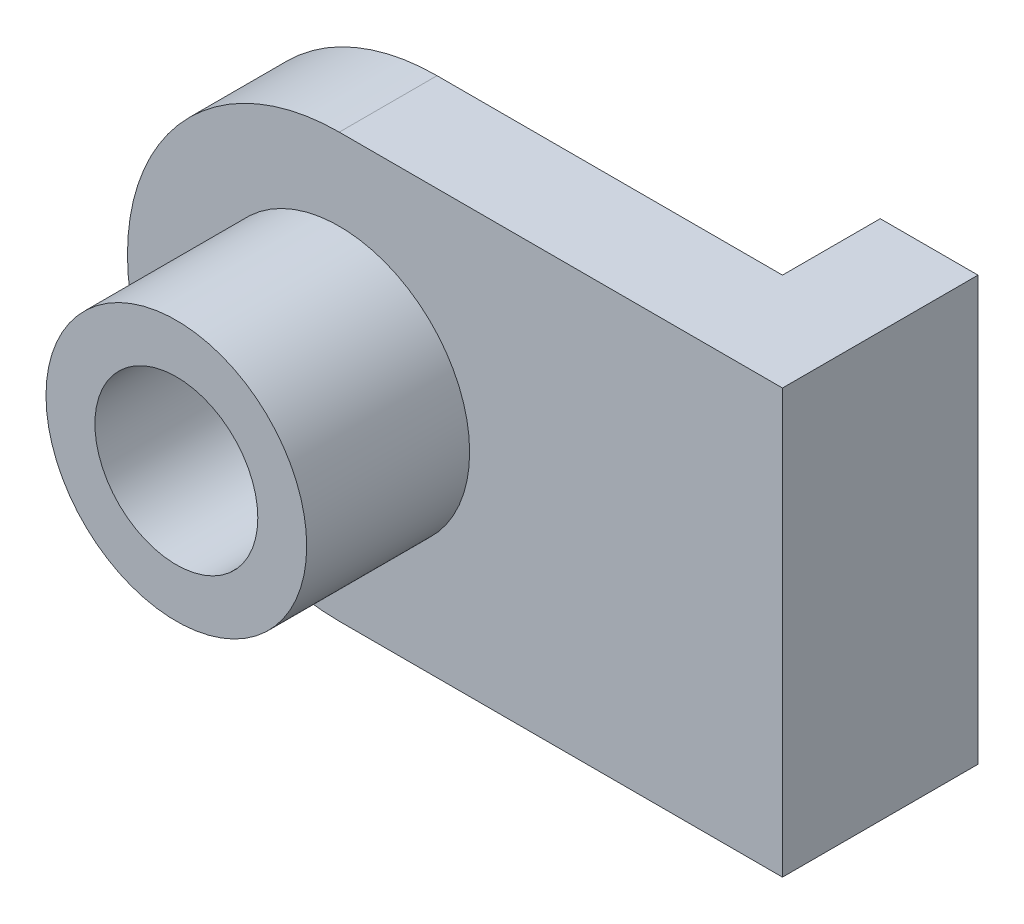
ISO-10303-21;
HEADER;
FILE_DESCRIPTION(('STEP AP214'),'2;1');
FILE_NAME('part.step','',(''),(''),'','','');
FILE_SCHEMA(('AUTOMOTIVE_DESIGN { 1 0 10303 214 1 1 1 1 }'));
ENDSEC;
DATA;
#1=APPLICATION_CONTEXT('core data for automotive mechanical design processes');
#2=APPLICATION_PROTOCOL_DEFINITION('international standard','automotive_design',2000,#1);
#3=PRODUCT_CONTEXT('',#1,'mechanical');
#4=PRODUCT('Part','Part','',(#3));
#5=PRODUCT_RELATED_PRODUCT_CATEGORY('part','',(#4));
#6=PRODUCT_DEFINITION_FORMATION('','',#4);
#7=PRODUCT_DEFINITION_CONTEXT('part definition',#1,'design');
#8=PRODUCT_DEFINITION('design','',#6,#7);
#9=PRODUCT_DEFINITION_SHAPE('','',#8);
#10=(LENGTH_UNIT() NAMED_UNIT(*) SI_UNIT(.MILLI.,.METRE.));
#11=(NAMED_UNIT(*) PLANE_ANGLE_UNIT() SI_UNIT($,.RADIAN.));
#12=(NAMED_UNIT(*) SI_UNIT($,.STERADIAN.) SOLID_ANGLE_UNIT());
#13=UNCERTAINTY_MEASURE_WITH_UNIT(LENGTH_MEASURE(1.E-05),#10,'distance_accuracy_value','');
#14=(GEOMETRIC_REPRESENTATION_CONTEXT(3) GLOBAL_UNCERTAINTY_ASSIGNED_CONTEXT((#13)) GLOBAL_UNIT_ASSIGNED_CONTEXT((#10,
#11,#12)) REPRESENTATION_CONTEXT('',''));
#15=CARTESIAN_POINT('',(0.,0.,0.));
#16=DIRECTION('',(0.,0.,1.));
#17=DIRECTION('',(1.,0.,0.));
#18=AXIS2_PLACEMENT_3D('',#15,#16,#17);
#19=CARTESIAN_POINT('',(0.,32.5,15.));
#20=DIRECTION('',(0.,0.,-1.));
#21=DIRECTION('',(-1.,0.,0.));
#22=AXIS2_PLACEMENT_3D('',#19,#20,#21);
#23=CYLINDRICAL_SURFACE('',#22,32.5);
#24=CARTESIAN_POINT('',(0.,32.5,0.));
#25=DIRECTION('',(0.,0.,1.));
#26=DIRECTION('',(1.,0.,0.));
#27=AXIS2_PLACEMENT_3D('',#24,#25,#26);
#28=CIRCLE('',#27,32.5);
#29=CARTESIAN_POINT('',(0.,65.,0.));
#30=VERTEX_POINT('',#29);
#31=CARTESIAN_POINT('',(0.,0.,0.));
#32=VERTEX_POINT('',#31);
#33=EDGE_CURVE('E131',#30,#32,#28,.T.);
#34=ORIENTED_EDGE('',*,*,#33,.T.);
#35=DIRECTION('',(0.,0.,-1.));
#36=VECTOR('',#35,1.);
#37=CARTESIAN_POINT('',(0.,0.,15.));
#38=LINE('',#37,#36);
#39=CARTESIAN_POINT('',(0.,0.,15.));
#40=VERTEX_POINT('',#39);
#41=EDGE_CURVE('E39',#40,#32,#38,.T.);
#42=ORIENTED_EDGE('',*,*,#41,.F.);
#43=CARTESIAN_POINT('',(0.,32.5,15.));
#44=DIRECTION('',(0.,0.,1.));
#45=DIRECTION('',(1.,0.,0.));
#46=AXIS2_PLACEMENT_3D('',#43,#44,#45);
#47=CIRCLE('',#46,32.5);
#48=CARTESIAN_POINT('',(0.,65.,15.));
#49=VERTEX_POINT('',#48);
#50=EDGE_CURVE('E133',#49,#40,#47,.T.);
#51=ORIENTED_EDGE('',*,*,#50,.F.);
#52=DIRECTION('',(0.,0.,-1.));
#53=VECTOR('',#52,1.);
#54=CARTESIAN_POINT('',(0.,65.,15.));
#55=LINE('',#54,#53);
#56=EDGE_CURVE('E139',#49,#30,#55,.T.);
#57=ORIENTED_EDGE('',*,*,#56,.T.);
#58=EDGE_LOOP('',(#34,#42,#51,#57));
#59=FACE_BOUND('',#58,.T.);
#60=ADVANCED_FACE('F36',(#59),#23,.T.);
#61=CARTESIAN_POINT('',(0.,0.,15.));
#62=DIRECTION('',(0.,1.,0.));
#63=DIRECTION('',(0.,0.,1.));
#64=AXIS2_PLACEMENT_3D('',#61,#62,#63);
#65=PLANE('',#64);
#66=DIRECTION('',(1.,0.,0.));
#67=VECTOR('',#66,1.);
#68=CARTESIAN_POINT('',(0.,0.,0.));
#69=LINE('',#68,#67);
#70=CARTESIAN_POINT('',(53.,0.,0.));
#71=VERTEX_POINT('',#70);
#72=EDGE_CURVE('E101',#32,#71,#69,.T.);
#73=ORIENTED_EDGE('',*,*,#72,.T.);
#74=DIRECTION('',(0.,0.,1.));
#75=VECTOR('',#74,1.);
#76=CARTESIAN_POINT('',(53.,0.,-15.));
#77=LINE('',#76,#75);
#78=CARTESIAN_POINT('',(53.,0.,-15.));
#79=VERTEX_POINT('',#78);
#80=EDGE_CURVE('E51',#79,#71,#77,.T.);
#81=ORIENTED_EDGE('',*,*,#80,.F.);
#82=DIRECTION('',(1.,0.,0.));
#83=VECTOR('',#82,1.);
#84=CARTESIAN_POINT('',(53.,0.,-15.));
#85=LINE('',#84,#83);
#86=CARTESIAN_POINT('',(68.,0.,-15.));
#87=VERTEX_POINT('',#86);
#88=EDGE_CURVE('E100',#79,#87,#85,.T.);
#89=ORIENTED_EDGE('',*,*,#88,.T.);
#90=DIRECTION('',(0.,0.,-1.));
#91=VECTOR('',#90,1.);
#92=CARTESIAN_POINT('',(68.,0.,15.));
#93=LINE('',#92,#91);
#94=CARTESIAN_POINT('',(68.,0.,15.));
#95=VERTEX_POINT('',#94);
#96=EDGE_CURVE('E146',#95,#87,#93,.T.);
#97=ORIENTED_EDGE('',*,*,#96,.F.);
#98=DIRECTION('',(1.,0.,0.));
#99=VECTOR('',#98,1.);
#100=CARTESIAN_POINT('',(0.,0.,15.));
#101=LINE('',#100,#99);
#102=EDGE_CURVE('E83',#40,#95,#101,.T.);
#103=ORIENTED_EDGE('',*,*,#102,.F.);
#104=ORIENTED_EDGE('',*,*,#41,.T.);
#105=EDGE_LOOP('',(#73,#81,#89,#97,#103,#104));
#106=FACE_BOUND('',#105,.T.);
#107=ADVANCED_FACE('F99',(#106),#65,.F.);
#108=CARTESIAN_POINT('',(68.,0.,15.));
#109=DIRECTION('',(-1.,0.,0.));
#110=DIRECTION('',(0.,0.,1.));
#111=AXIS2_PLACEMENT_3D('',#108,#109,#110);
#112=PLANE('',#111);
#113=ORIENTED_EDGE('',*,*,#96,.T.);
#114=DIRECTION('',(0.,1.,0.));
#115=VECTOR('',#114,1.);
#116=CARTESIAN_POINT('',(68.,0.,-15.));
#117=LINE('',#116,#115);
#118=CARTESIAN_POINT('',(68.,65.,-15.));
#119=VERTEX_POINT('',#118);
#120=EDGE_CURVE('E113',#87,#119,#117,.T.);
#121=ORIENTED_EDGE('',*,*,#120,.T.);
#122=DIRECTION('',(0.,0.,-1.));
#123=VECTOR('',#122,1.);
#124=CARTESIAN_POINT('',(68.,65.,15.));
#125=LINE('',#124,#123);
#126=CARTESIAN_POINT('',(68.,65.,15.));
#127=VERTEX_POINT('',#126);
#128=EDGE_CURVE('E145',#127,#119,#125,.T.);
#129=ORIENTED_EDGE('',*,*,#128,.F.);
#130=DIRECTION('',(0.,1.,0.));
#131=VECTOR('',#130,1.);
#132=CARTESIAN_POINT('',(68.,0.,15.));
#133=LINE('',#132,#131);
#134=EDGE_CURVE('E136',#95,#127,#133,.T.);
#135=ORIENTED_EDGE('',*,*,#134,.F.);
#136=EDGE_LOOP('',(#113,#121,#129,#135));
#137=FACE_BOUND('',#136,.T.);
#138=ADVANCED_FACE('F175',(#137),#112,.F.);
#139=CARTESIAN_POINT('',(68.,65.,15.));
#140=DIRECTION('',(0.,-1.,0.));
#141=DIRECTION('',(0.,0.,-1.));
#142=AXIS2_PLACEMENT_3D('',#139,#140,#141);
#143=PLANE('',#142);
#144=ORIENTED_EDGE('',*,*,#128,.T.);
#145=DIRECTION('',(-1.,0.,0.));
#146=VECTOR('',#145,1.);
#147=CARTESIAN_POINT('',(68.,65.,-15.));
#148=LINE('',#147,#146);
#149=CARTESIAN_POINT('',(53.,65.,-15.));
#150=VERTEX_POINT('',#149);
#151=EDGE_CURVE('E103',#119,#150,#148,.T.);
#152=ORIENTED_EDGE('',*,*,#151,.T.);
#153=DIRECTION('',(0.,0.,1.));
#154=VECTOR('',#153,1.);
#155=CARTESIAN_POINT('',(53.,65.,-15.));
#156=LINE('',#155,#154);
#157=CARTESIAN_POINT('',(53.,65.,0.));
#158=VERTEX_POINT('',#157);
#159=EDGE_CURVE('E102',#150,#158,#156,.T.);
#160=ORIENTED_EDGE('',*,*,#159,.T.);
#161=DIRECTION('',(-1.,0.,0.));
#162=VECTOR('',#161,1.);
#163=CARTESIAN_POINT('',(68.,65.,0.));
#164=LINE('',#163,#162);
#165=EDGE_CURVE('E75',#158,#30,#164,.T.);
#166=ORIENTED_EDGE('',*,*,#165,.T.);
#167=ORIENTED_EDGE('',*,*,#56,.F.);
#168=DIRECTION('',(-1.,0.,0.));
#169=VECTOR('',#168,1.);
#170=CARTESIAN_POINT('',(68.,65.,15.));
#171=LINE('',#170,#169);
#172=EDGE_CURVE('E60',#127,#49,#171,.T.);
#173=ORIENTED_EDGE('',*,*,#172,.F.);
#174=EDGE_LOOP('',(#144,#152,#160,#166,#167,#173));
#175=FACE_BOUND('',#174,.T.);
#176=ADVANCED_FACE('F167',(#175),#143,.F.);
#177=CARTESIAN_POINT('',(0.,32.5,15.));
#178=DIRECTION('',(0.,0.,1.));
#179=DIRECTION('',(1.,0.,0.));
#180=AXIS2_PLACEMENT_3D('',#177,#178,#179);
#181=PLANE('',#180);
#182=CARTESIAN_POINT('',(0.,32.5,15.));
#183=DIRECTION('',(0.,0.,1.));
#184=DIRECTION('',(1.,0.,0.));
#185=AXIS2_PLACEMENT_3D('',#182,#183,#184);
#186=CIRCLE('',#185,20.);
#187=CARTESIAN_POINT('',(20.,32.5,15.));
#188=VERTEX_POINT('',#187);
#189=EDGE_CURVE('E11',#188,#188,#186,.T.);
#190=ORIENTED_EDGE('',*,*,#189,.F.);
#191=EDGE_LOOP('',(#190));
#192=FACE_BOUND('',#191,.T.);
#193=ORIENTED_EDGE('',*,*,#50,.T.);
#194=ORIENTED_EDGE('',*,*,#102,.T.);
#195=ORIENTED_EDGE('',*,*,#134,.T.);
#196=ORIENTED_EDGE('',*,*,#172,.T.);
#197=EDGE_LOOP('',(#193,#194,#195,#196));
#198=FACE_BOUND('',#197,.T.);
#199=ADVANCED_FACE('F157',(#192,#198),#181,.T.);
#200=CARTESIAN_POINT('',(0.,32.5,0.));
#201=DIRECTION('',(0.,0.,1.));
#202=DIRECTION('',(1.,0.,0.));
#203=AXIS2_PLACEMENT_3D('',#200,#201,#202);
#204=PLANE('',#203);
#205=CARTESIAN_POINT('',(0.,32.5,0.));
#206=DIRECTION('',(0.,0.,1.));
#207=DIRECTION('',(1.,0.,0.));
#208=AXIS2_PLACEMENT_3D('',#205,#206,#207);
#209=CIRCLE('',#208,12.5);
#210=CARTESIAN_POINT('',(12.5,32.5,0.));
#211=VERTEX_POINT('',#210);
#212=EDGE_CURVE('E124',#211,#211,#209,.T.);
#213=ORIENTED_EDGE('',*,*,#212,.T.);
#214=EDGE_LOOP('',(#213));
#215=FACE_BOUND('',#214,.T.);
#216=ORIENTED_EDGE('',*,*,#165,.F.);
#217=DIRECTION('',(0.,-1.,0.));
#218=VECTOR('',#217,1.);
#219=CARTESIAN_POINT('',(53.,65.,0.));
#220=LINE('',#219,#218);
#221=EDGE_CURVE('E116',#158,#71,#220,.T.);
#222=ORIENTED_EDGE('',*,*,#221,.T.);
#223=ORIENTED_EDGE('',*,*,#72,.F.);
#224=ORIENTED_EDGE('',*,*,#33,.F.);
#225=EDGE_LOOP('',(#216,#222,#223,#224));
#226=FACE_BOUND('',#225,.T.);
#227=ADVANCED_FACE('F154',(#215,#226),#204,.F.);
#228=CARTESIAN_POINT('',(0.,32.5,40.));
#229=DIRECTION('',(0.,0.,-1.));
#230=DIRECTION('',(-1.,0.,0.));
#231=AXIS2_PLACEMENT_3D('',#228,#229,#230);
#232=CYLINDRICAL_SURFACE('',#231,20.);
#233=CARTESIAN_POINT('',(0.,32.5,40.));
#234=DIRECTION('',(0.,0.,1.));
#235=DIRECTION('',(1.,0.,0.));
#236=AXIS2_PLACEMENT_3D('',#233,#234,#235);
#237=CIRCLE('',#236,20.);
#238=CARTESIAN_POINT('',(20.,32.5,40.));
#239=VERTEX_POINT('',#238);
#240=EDGE_CURVE('E127',#239,#239,#237,.T.);
#241=ORIENTED_EDGE('',*,*,#240,.F.);
#242=EDGE_LOOP('',(#241));
#243=FACE_BOUND('',#242,.T.);
#244=ORIENTED_EDGE('',*,*,#189,.T.);
#245=EDGE_LOOP('',(#244));
#246=FACE_BOUND('',#245,.T.);
#247=ADVANCED_FACE('F156',(#243,#246),#232,.T.);
#248=CARTESIAN_POINT('',(0.,32.5,40.));
#249=DIRECTION('',(0.,0.,1.));
#250=DIRECTION('',(1.,0.,0.));
#251=AXIS2_PLACEMENT_3D('',#248,#249,#250);
#252=PLANE('',#251);
#253=CARTESIAN_POINT('',(0.,32.5,40.));
#254=DIRECTION('',(0.,0.,1.));
#255=DIRECTION('',(1.,0.,0.));
#256=AXIS2_PLACEMENT_3D('',#253,#254,#255);
#257=CIRCLE('',#256,12.5);
#258=CARTESIAN_POINT('',(12.5,32.5,40.));
#259=VERTEX_POINT('',#258);
#260=EDGE_CURVE('E122',#259,#259,#257,.T.);
#261=ORIENTED_EDGE('',*,*,#260,.F.);
#262=EDGE_LOOP('',(#261));
#263=FACE_BOUND('',#262,.T.);
#264=ORIENTED_EDGE('',*,*,#240,.T.);
#265=EDGE_LOOP('',(#264));
#266=FACE_BOUND('',#265,.T.);
#267=ADVANCED_FACE('F164',(#263,#266),#252,.T.);
#268=CARTESIAN_POINT('',(0.,32.5,0.));
#269=DIRECTION('',(0.,0.,1.));
#270=DIRECTION('',(1.,0.,0.));
#271=AXIS2_PLACEMENT_3D('',#268,#269,#270);
#272=CYLINDRICAL_SURFACE('',#271,12.5);
#273=ORIENTED_EDGE('',*,*,#212,.F.);
#274=EDGE_LOOP('',(#273));
#275=FACE_BOUND('',#274,.T.);
#276=ORIENTED_EDGE('',*,*,#260,.T.);
#277=EDGE_LOOP('',(#276));
#278=FACE_BOUND('',#277,.T.);
#279=ADVANCED_FACE('F209',(#275,#278),#272,.F.);
#280=CARTESIAN_POINT('',(53.,65.,-15.));
#281=DIRECTION('',(-1.,0.,0.));
#282=DIRECTION('',(0.,-1.,0.));
#283=AXIS2_PLACEMENT_3D('',#280,#281,#282);
#284=PLANE('',#283);
#285=ORIENTED_EDGE('',*,*,#221,.F.);
#286=ORIENTED_EDGE('',*,*,#159,.F.);
#287=DIRECTION('',(0.,-1.,0.));
#288=VECTOR('',#287,1.);
#289=CARTESIAN_POINT('',(53.,65.,-15.));
#290=LINE('',#289,#288);
#291=EDGE_CURVE('E110',#150,#79,#290,.T.);
#292=ORIENTED_EDGE('',*,*,#291,.T.);
#293=ORIENTED_EDGE('',*,*,#80,.T.);
#294=EDGE_LOOP('',(#285,#286,#292,#293));
#295=FACE_BOUND('',#294,.T.);
#296=ADVANCED_FACE('F115',(#295),#284,.T.);
#297=CARTESIAN_POINT('',(0.,0.,-15.));
#298=DIRECTION('',(0.,0.,1.));
#299=DIRECTION('',(1.,0.,0.));
#300=AXIS2_PLACEMENT_3D('',#297,#298,#299);
#301=PLANE('',#300);
#302=ORIENTED_EDGE('',*,*,#291,.F.);
#303=ORIENTED_EDGE('',*,*,#151,.F.);
#304=ORIENTED_EDGE('',*,*,#120,.F.);
#305=ORIENTED_EDGE('',*,*,#88,.F.);
#306=EDGE_LOOP('',(#302,#303,#304,#305));
#307=FACE_BOUND('',#306,.T.);
#308=ADVANCED_FACE('F108',(#307),#301,.F.);
#309=CLOSED_SHELL('',(#60,#107,#138,#176,#199,#227,#247,#267,#279,#296,#308));
#310=MANIFOLD_SOLID_BREP('B2',#309);
#311=ADVANCED_BREP_SHAPE_REPRESENTATION('',(#18,#310),#14);
#312=SHAPE_DEFINITION_REPRESENTATION(#9,#311);
ENDSEC;
END-ISO-10303-21;
